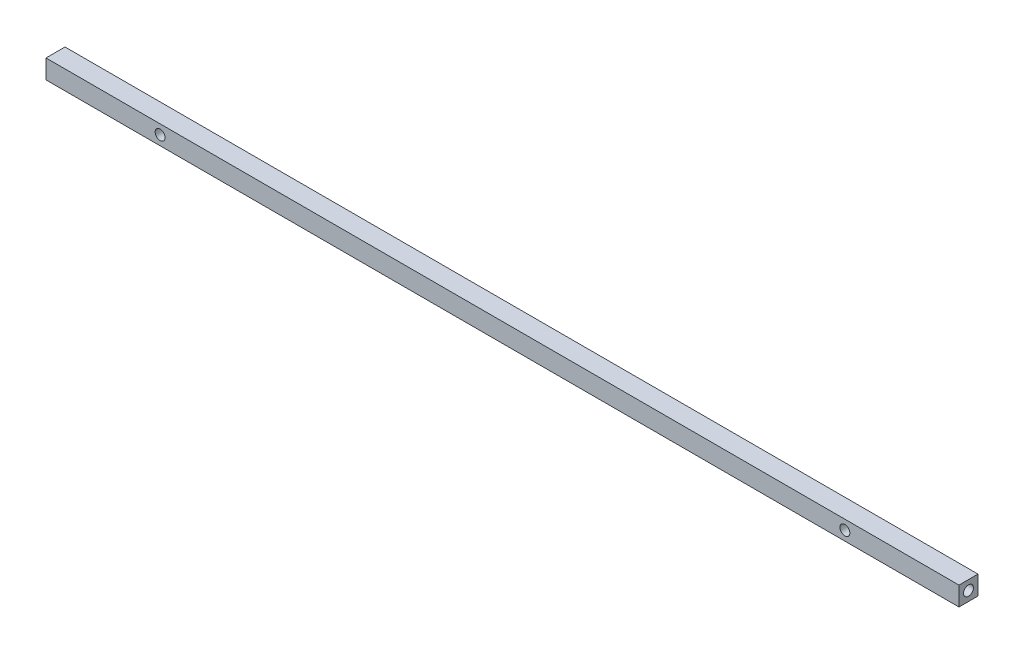
ISO-10303-21;
HEADER;
FILE_DESCRIPTION(('STEP AP214'),'2;1');
FILE_NAME('part.step','',(''),(''),'','','');
FILE_SCHEMA(('AUTOMOTIVE_DESIGN { 1 0 10303 214 1 1 1 1 }'));
ENDSEC;
DATA;
#1=APPLICATION_CONTEXT('core data for automotive mechanical design processes');
#2=APPLICATION_PROTOCOL_DEFINITION('international standard','automotive_design',2000,#1);
#3=PRODUCT_CONTEXT('',#1,'mechanical');
#4=PRODUCT('Part','Part','',(#3));
#5=PRODUCT_RELATED_PRODUCT_CATEGORY('part','',(#4));
#6=PRODUCT_DEFINITION_FORMATION('','',#4);
#7=PRODUCT_DEFINITION_CONTEXT('part definition',#1,'design');
#8=PRODUCT_DEFINITION('design','',#6,#7);
#9=PRODUCT_DEFINITION_SHAPE('','',#8);
#10=(LENGTH_UNIT() NAMED_UNIT(*) SI_UNIT(.MILLI.,.METRE.));
#11=(NAMED_UNIT(*) PLANE_ANGLE_UNIT() SI_UNIT($,.RADIAN.));
#12=(NAMED_UNIT(*) SI_UNIT($,.STERADIAN.) SOLID_ANGLE_UNIT());
#13=UNCERTAINTY_MEASURE_WITH_UNIT(LENGTH_MEASURE(1.E-05),#10,'distance_accuracy_value','');
#14=(GEOMETRIC_REPRESENTATION_CONTEXT(3) GLOBAL_UNCERTAINTY_ASSIGNED_CONTEXT((#13)) GLOBAL_UNIT_ASSIGNED_CONTEXT((#10,
#11,#12)) REPRESENTATION_CONTEXT('',''));
#15=CARTESIAN_POINT('',(0.,0.,0.));
#16=DIRECTION('',(0.,0.,1.));
#17=DIRECTION('',(1.,0.,0.));
#18=AXIS2_PLACEMENT_3D('',#15,#16,#17);
#19=CARTESIAN_POINT('',(152.4,-3.175,-3.175));
#20=DIRECTION('',(0.,0.,1.));
#21=DIRECTION('',(1.,0.,0.));
#22=AXIS2_PLACEMENT_3D('',#19,#20,#21);
#23=PLANE('',#22);
#24=CARTESIAN_POINT('',(-114.300000000001,-7.91033905045424E-13,-3.175));
#25=DIRECTION('',(0.,0.,-1.));
#26=DIRECTION('',(-1.,0.,0.));
#27=AXIS2_PLACEMENT_3D('',#24,#25,#26);
#28=CIRCLE('',#27,1.65100000000001);
#29=CARTESIAN_POINT('',(-115.951000000001,-7.91033905045424E-13,-3.175));
#30=VERTEX_POINT('',#29);
#31=EDGE_CURVE('E131',#30,#30,#28,.T.);
#32=ORIENTED_EDGE('',*,*,#31,.F.);
#33=EDGE_LOOP('',(#32));
#34=FACE_BOUND('',#33,.T.);
#35=CARTESIAN_POINT('',(114.300000000001,-7.91033905045424E-13,-3.175));
#36=DIRECTION('',(0.,0.,1.));
#37=DIRECTION('',(1.,0.,0.));
#38=AXIS2_PLACEMENT_3D('',#35,#36,#37);
#39=CIRCLE('',#38,1.65100000000001);
#40=CARTESIAN_POINT('',(115.951000000001,-7.91033905045424E-13,-3.175));
#41=VERTEX_POINT('',#40);
#42=EDGE_CURVE('E119',#41,#41,#39,.T.);
#43=ORIENTED_EDGE('',*,*,#42,.T.);
#44=EDGE_LOOP('',(#43));
#45=FACE_BOUND('',#44,.T.);
#46=DIRECTION('',(0.,1.,0.));
#47=VECTOR('',#46,1.);
#48=CARTESIAN_POINT('',(-152.4,-3.175,-3.175));
#49=LINE('',#48,#47);
#50=CARTESIAN_POINT('',(-152.4,-3.175,-3.175));
#51=VERTEX_POINT('',#50);
#52=CARTESIAN_POINT('',(-152.4,3.175,-3.175));
#53=VERTEX_POINT('',#52);
#54=EDGE_CURVE('E102',#51,#53,#49,.T.);
#55=ORIENTED_EDGE('',*,*,#54,.T.);
#56=DIRECTION('',(-1.,0.,0.));
#57=VECTOR('',#56,1.);
#58=CARTESIAN_POINT('',(152.4,3.175,-3.175));
#59=LINE('',#58,#57);
#60=CARTESIAN_POINT('',(152.4,3.175,-3.175));
#61=VERTEX_POINT('',#60);
#62=EDGE_CURVE('E11',#61,#53,#59,.T.);
#63=ORIENTED_EDGE('',*,*,#62,.F.);
#64=DIRECTION('',(0.,1.,0.));
#65=VECTOR('',#64,1.);
#66=CARTESIAN_POINT('',(152.4,-3.175,-3.175));
#67=LINE('',#66,#65);
#68=CARTESIAN_POINT('',(152.4,-3.175,-3.175));
#69=VERTEX_POINT('',#68);
#70=EDGE_CURVE('E90',#69,#61,#67,.T.);
#71=ORIENTED_EDGE('',*,*,#70,.F.);
#72=DIRECTION('',(-1.,0.,0.));
#73=VECTOR('',#72,1.);
#74=CARTESIAN_POINT('',(152.4,-3.175,-3.175));
#75=LINE('',#74,#73);
#76=EDGE_CURVE('E98',#69,#51,#75,.T.);
#77=ORIENTED_EDGE('',*,*,#76,.T.);
#78=EDGE_LOOP('',(#55,#63,#71,#77));
#79=FACE_BOUND('',#78,.T.);
#80=ADVANCED_FACE('F39',(#34,#45,#79),#23,.F.);
#81=CARTESIAN_POINT('',(152.4,3.175,3.175));
#82=DIRECTION('',(0.,-1.,0.));
#83=DIRECTION('',(0.,0.,-1.));
#84=AXIS2_PLACEMENT_3D('',#81,#82,#83);
#85=PLANE('',#84);
#86=DIRECTION('',(0.,0.,1.));
#87=VECTOR('',#86,1.);
#88=CARTESIAN_POINT('',(-152.4,3.175,3.175));
#89=LINE('',#88,#87);
#90=CARTESIAN_POINT('',(-152.4,3.175,3.175));
#91=VERTEX_POINT('',#90);
#92=EDGE_CURVE('E94',#53,#91,#89,.T.);
#93=ORIENTED_EDGE('',*,*,#92,.T.);
#94=DIRECTION('',(-1.,0.,0.));
#95=VECTOR('',#94,1.);
#96=CARTESIAN_POINT('',(152.4,3.175,3.175));
#97=LINE('',#96,#95);
#98=CARTESIAN_POINT('',(152.4,3.175,3.175));
#99=VERTEX_POINT('',#98);
#100=EDGE_CURVE('E47',#99,#91,#97,.T.);
#101=ORIENTED_EDGE('',*,*,#100,.F.);
#102=DIRECTION('',(0.,0.,1.));
#103=VECTOR('',#102,1.);
#104=CARTESIAN_POINT('',(152.4,3.175,3.175));
#105=LINE('',#104,#103);
#106=EDGE_CURVE('E85',#61,#99,#105,.T.);
#107=ORIENTED_EDGE('',*,*,#106,.F.);
#108=ORIENTED_EDGE('',*,*,#62,.T.);
#109=EDGE_LOOP('',(#93,#101,#107,#108));
#110=FACE_BOUND('',#109,.T.);
#111=ADVANCED_FACE('F93',(#110),#85,.F.);
#112=CARTESIAN_POINT('',(152.4,-3.175,3.175));
#113=DIRECTION('',(0.,0.,-1.));
#114=DIRECTION('',(-1.,0.,0.));
#115=AXIS2_PLACEMENT_3D('',#112,#113,#114);
#116=PLANE('',#115);
#117=CARTESIAN_POINT('',(-114.300000000001,-7.91033905045424E-13,3.175));
#118=DIRECTION('',(0.,0.,-1.));
#119=DIRECTION('',(-1.,0.,0.));
#120=AXIS2_PLACEMENT_3D('',#117,#118,#119);
#121=CIRCLE('',#120,1.65100000000001);
#122=CARTESIAN_POINT('',(-115.951000000001,-7.91033905045424E-13,3.175));
#123=VERTEX_POINT('',#122);
#124=EDGE_CURVE('E134',#123,#123,#121,.T.);
#125=ORIENTED_EDGE('',*,*,#124,.T.);
#126=EDGE_LOOP('',(#125));
#127=FACE_BOUND('',#126,.T.);
#128=CARTESIAN_POINT('',(114.300000000001,-7.91033905045424E-13,3.175));
#129=DIRECTION('',(0.,0.,1.));
#130=DIRECTION('',(1.,0.,0.));
#131=AXIS2_PLACEMENT_3D('',#128,#129,#130);
#132=CIRCLE('',#131,1.65100000000001);
#133=CARTESIAN_POINT('',(115.951000000001,-7.91033905045424E-13,3.175));
#134=VERTEX_POINT('',#133);
#135=EDGE_CURVE('E122',#134,#134,#132,.T.);
#136=ORIENTED_EDGE('',*,*,#135,.F.);
#137=EDGE_LOOP('',(#136));
#138=FACE_BOUND('',#137,.T.);
#139=DIRECTION('',(0.,-1.,0.));
#140=VECTOR('',#139,1.);
#141=CARTESIAN_POINT('',(-152.4,-3.175,3.175));
#142=LINE('',#141,#140);
#143=CARTESIAN_POINT('',(-152.4,-3.175,3.175));
#144=VERTEX_POINT('',#143);
#145=EDGE_CURVE('E72',#91,#144,#142,.T.);
#146=ORIENTED_EDGE('',*,*,#145,.T.);
#147=DIRECTION('',(-1.,0.,0.));
#148=VECTOR('',#147,1.);
#149=CARTESIAN_POINT('',(152.4,-3.175,3.175));
#150=LINE('',#149,#148);
#151=CARTESIAN_POINT('',(152.4,-3.175,3.175));
#152=VERTEX_POINT('',#151);
#153=EDGE_CURVE('E95',#152,#144,#150,.T.);
#154=ORIENTED_EDGE('',*,*,#153,.F.);
#155=DIRECTION('',(0.,-1.,0.));
#156=VECTOR('',#155,1.);
#157=CARTESIAN_POINT('',(152.4,-3.175,3.175));
#158=LINE('',#157,#156);
#159=EDGE_CURVE('E88',#99,#152,#158,.T.);
#160=ORIENTED_EDGE('',*,*,#159,.F.);
#161=ORIENTED_EDGE('',*,*,#100,.T.);
#162=EDGE_LOOP('',(#146,#154,#160,#161));
#163=FACE_BOUND('',#162,.T.);
#164=ADVANCED_FACE('F96',(#127,#138,#163),#116,.F.);
#165=CARTESIAN_POINT('',(152.4,-3.175,3.175));
#166=DIRECTION('',(0.,1.,0.));
#167=DIRECTION('',(0.,0.,1.));
#168=AXIS2_PLACEMENT_3D('',#165,#166,#167);
#169=PLANE('',#168);
#170=DIRECTION('',(0.,0.,-1.));
#171=VECTOR('',#170,1.);
#172=CARTESIAN_POINT('',(-152.4,-3.175,3.175));
#173=LINE('',#172,#171);
#174=EDGE_CURVE('E78',#144,#51,#173,.T.);
#175=ORIENTED_EDGE('',*,*,#174,.T.);
#176=ORIENTED_EDGE('',*,*,#76,.F.);
#177=DIRECTION('',(0.,0.,-1.));
#178=VECTOR('',#177,1.);
#179=CARTESIAN_POINT('',(152.4,-3.175,3.175));
#180=LINE('',#179,#178);
#181=EDGE_CURVE('E55',#152,#69,#180,.T.);
#182=ORIENTED_EDGE('',*,*,#181,.F.);
#183=ORIENTED_EDGE('',*,*,#153,.T.);
#184=EDGE_LOOP('',(#175,#176,#182,#183));
#185=FACE_BOUND('',#184,.T.);
#186=ADVANCED_FACE('F110',(#185),#169,.F.);
#187=CARTESIAN_POINT('',(152.4,0.,0.));
#188=DIRECTION('',(-1.,0.,0.));
#189=DIRECTION('',(0.,0.,1.));
#190=AXIS2_PLACEMENT_3D('',#187,#188,#189);
#191=PLANE('',#190);
#192=CARTESIAN_POINT('',(152.4,0.,0.));
#193=DIRECTION('',(1.,0.,0.));
#194=DIRECTION('',(0.,0.,-1.));
#195=AXIS2_PLACEMENT_3D('',#192,#193,#194);
#196=CIRCLE('',#195,1.651);
#197=CARTESIAN_POINT('',(152.4,0.,-1.651));
#198=VERTEX_POINT('',#197);
#199=EDGE_CURVE('E116',#198,#198,#196,.T.);
#200=ORIENTED_EDGE('',*,*,#199,.F.);
#201=EDGE_LOOP('',(#200));
#202=FACE_BOUND('',#201,.T.);
#203=ORIENTED_EDGE('',*,*,#70,.T.);
#204=ORIENTED_EDGE('',*,*,#106,.T.);
#205=ORIENTED_EDGE('',*,*,#159,.T.);
#206=ORIENTED_EDGE('',*,*,#181,.T.);
#207=EDGE_LOOP('',(#203,#204,#205,#206));
#208=FACE_BOUND('',#207,.T.);
#209=ADVANCED_FACE('F86',(#202,#208),#191,.F.);
#210=CARTESIAN_POINT('',(-152.4,0.,0.));
#211=DIRECTION('',(-1.,0.,0.));
#212=DIRECTION('',(0.,0.,1.));
#213=AXIS2_PLACEMENT_3D('',#210,#211,#212);
#214=PLANE('',#213);
#215=CARTESIAN_POINT('',(-152.4,0.,0.));
#216=DIRECTION('',(1.,0.,0.));
#217=DIRECTION('',(0.,0.,-1.));
#218=AXIS2_PLACEMENT_3D('',#215,#216,#217);
#219=CIRCLE('',#218,1.651);
#220=CARTESIAN_POINT('',(-152.4,0.,-1.651));
#221=VERTEX_POINT('',#220);
#222=EDGE_CURVE('E128',#221,#221,#219,.T.);
#223=ORIENTED_EDGE('',*,*,#222,.T.);
#224=EDGE_LOOP('',(#223));
#225=FACE_BOUND('',#224,.T.);
#226=ORIENTED_EDGE('',*,*,#54,.F.);
#227=ORIENTED_EDGE('',*,*,#174,.F.);
#228=ORIENTED_EDGE('',*,*,#145,.F.);
#229=ORIENTED_EDGE('',*,*,#92,.F.);
#230=EDGE_LOOP('',(#226,#227,#228,#229));
#231=FACE_BOUND('',#230,.T.);
#232=ADVANCED_FACE('F113',(#225,#231),#214,.T.);
#233=CARTESIAN_POINT('',(139.7,0.,0.));
#234=DIRECTION('',(1.,0.,0.));
#235=DIRECTION('',(0.,0.,-1.));
#236=AXIS2_PLACEMENT_3D('',#233,#234,#235);
#237=CYLINDRICAL_SURFACE('',#236,1.651);
#238=CARTESIAN_POINT('',(139.7,0.,0.));
#239=DIRECTION('',(1.,0.,0.));
#240=DIRECTION('',(0.,0.,-1.));
#241=AXIS2_PLACEMENT_3D('',#238,#239,#240);
#242=CIRCLE('',#241,1.651);
#243=CARTESIAN_POINT('',(139.7,0.,-1.651));
#244=VERTEX_POINT('',#243);
#245=EDGE_CURVE('E105',#244,#244,#242,.T.);
#246=ORIENTED_EDGE('',*,*,#245,.F.);
#247=EDGE_LOOP('',(#246));
#248=FACE_BOUND('',#247,.T.);
#249=ORIENTED_EDGE('',*,*,#199,.T.);
#250=EDGE_LOOP('',(#249));
#251=FACE_BOUND('',#250,.T.);
#252=ADVANCED_FACE('F166',(#248,#251),#237,.F.);
#253=CARTESIAN_POINT('',(139.7,0.,0.));
#254=DIRECTION('',(1.,0.,0.));
#255=DIRECTION('',(0.,0.,-1.));
#256=AXIS2_PLACEMENT_3D('',#253,#254,#255);
#257=PLANE('',#256);
#258=ORIENTED_EDGE('',*,*,#245,.T.);
#259=EDGE_LOOP('',(#258));
#260=FACE_BOUND('',#259,.T.);
#261=ADVANCED_FACE('F151',(#260),#257,.T.);
#262=CARTESIAN_POINT('',(114.300000000001,-7.91033905045424E-13,-3.175));
#263=DIRECTION('',(0.,0.,1.));
#264=DIRECTION('',(1.,0.,0.));
#265=AXIS2_PLACEMENT_3D('',#262,#263,#264);
#266=CYLINDRICAL_SURFACE('',#265,1.65100000000001);
#267=ORIENTED_EDGE('',*,*,#42,.F.);
#268=EDGE_LOOP('',(#267));
#269=FACE_BOUND('',#268,.T.);
#270=ORIENTED_EDGE('',*,*,#135,.T.);
#271=EDGE_LOOP('',(#270));
#272=FACE_BOUND('',#271,.T.);
#273=ADVANCED_FACE('F147',(#269,#272),#266,.F.);
#274=CARTESIAN_POINT('',(-139.7,0.,0.));
#275=DIRECTION('',(-1.,0.,0.));
#276=DIRECTION('',(0.,0.,1.));
#277=AXIS2_PLACEMENT_3D('',#274,#275,#276);
#278=CYLINDRICAL_SURFACE('',#277,1.651);
#279=CARTESIAN_POINT('',(-139.7,0.,0.));
#280=DIRECTION('',(1.,0.,0.));
#281=DIRECTION('',(0.,0.,-1.));
#282=AXIS2_PLACEMENT_3D('',#279,#280,#281);
#283=CIRCLE('',#282,1.651);
#284=CARTESIAN_POINT('',(-139.7,0.,-1.651));
#285=VERTEX_POINT('',#284);
#286=EDGE_CURVE('E125',#285,#285,#283,.T.);
#287=ORIENTED_EDGE('',*,*,#286,.T.);
#288=EDGE_LOOP('',(#287));
#289=FACE_BOUND('',#288,.T.);
#290=ORIENTED_EDGE('',*,*,#222,.F.);
#291=EDGE_LOOP('',(#290));
#292=FACE_BOUND('',#291,.T.);
#293=ADVANCED_FACE('F150',(#289,#292),#278,.F.);
#294=CARTESIAN_POINT('',(-139.7,0.,0.));
#295=DIRECTION('',(-1.,0.,0.));
#296=DIRECTION('',(0.,0.,-1.));
#297=AXIS2_PLACEMENT_3D('',#294,#295,#296);
#298=PLANE('',#297);
#299=ORIENTED_EDGE('',*,*,#286,.F.);
#300=EDGE_LOOP('',(#299));
#301=FACE_BOUND('',#300,.T.);
#302=ADVANCED_FACE('F179',(#301),#298,.T.);
#303=CARTESIAN_POINT('',(-114.300000000001,-7.91033905045424E-13,-3.175));
#304=DIRECTION('',(0.,0.,1.));
#305=DIRECTION('',(1.,0.,0.));
#306=AXIS2_PLACEMENT_3D('',#303,#304,#305);
#307=CYLINDRICAL_SURFACE('',#306,1.65100000000001);
#308=ORIENTED_EDGE('',*,*,#31,.T.);
#309=EDGE_LOOP('',(#308));
#310=FACE_BOUND('',#309,.T.);
#311=ORIENTED_EDGE('',*,*,#124,.F.);
#312=EDGE_LOOP('',(#311));
#313=FACE_BOUND('',#312,.T.);
#314=ADVANCED_FACE('F140',(#310,#313),#307,.F.);
#315=CLOSED_SHELL('',(#80,#111,#164,#186,#209,#232,#252,#261,#273,#293,#302,#314));
#316=MANIFOLD_SOLID_BREP('B2',#315);
#317=ADVANCED_BREP_SHAPE_REPRESENTATION('',(#18,#316),#14);
#318=SHAPE_DEFINITION_REPRESENTATION(#9,#317);
ENDSEC;
END-ISO-10303-21;
